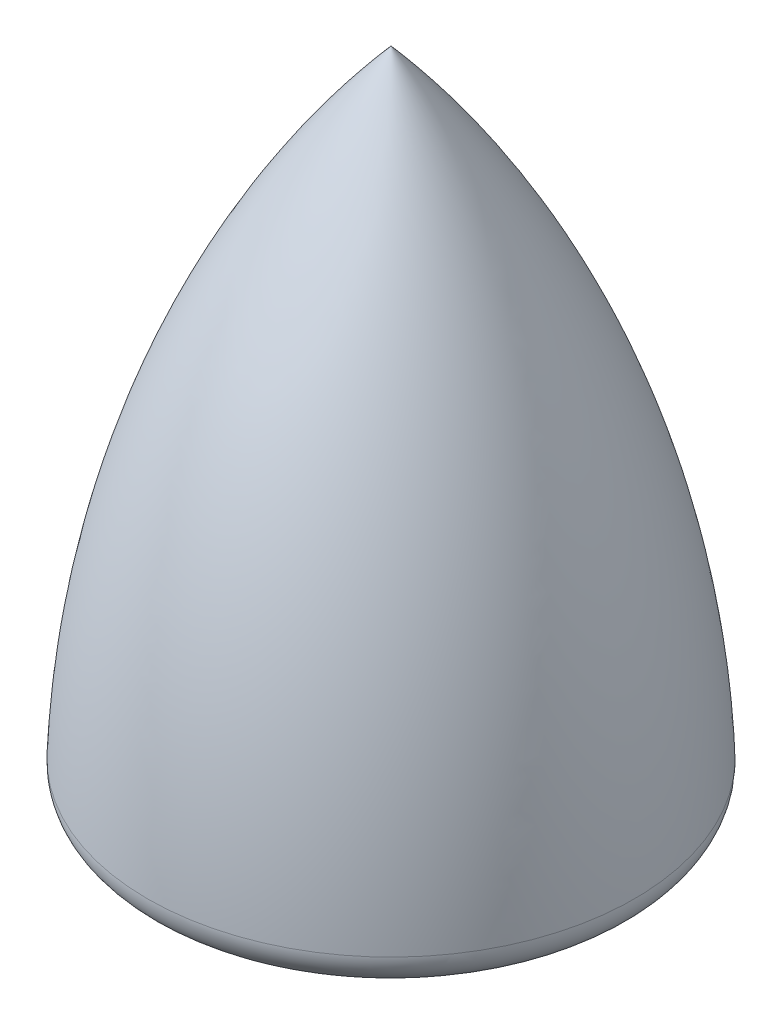
ISO-10303-21;
HEADER;
FILE_DESCRIPTION(('STEP AP214'),'2;1');
FILE_NAME('part.step','',(''),(''),'','','');
FILE_SCHEMA(('AUTOMOTIVE_DESIGN { 1 0 10303 214 1 1 1 1 }'));
ENDSEC;
DATA;
#1=APPLICATION_CONTEXT('core data for automotive mechanical design processes');
#2=APPLICATION_PROTOCOL_DEFINITION('international standard','automotive_design',2000,#1);
#3=PRODUCT_CONTEXT('',#1,'mechanical');
#4=PRODUCT('Part','Part','',(#3));
#5=PRODUCT_RELATED_PRODUCT_CATEGORY('part','',(#4));
#6=PRODUCT_DEFINITION_FORMATION('','',#4);
#7=PRODUCT_DEFINITION_CONTEXT('part definition',#1,'design');
#8=PRODUCT_DEFINITION('design','',#6,#7);
#9=PRODUCT_DEFINITION_SHAPE('','',#8);
#10=(LENGTH_UNIT() NAMED_UNIT(*) SI_UNIT(.MILLI.,.METRE.));
#11=(NAMED_UNIT(*) PLANE_ANGLE_UNIT() SI_UNIT($,.RADIAN.));
#12=(NAMED_UNIT(*) SI_UNIT($,.STERADIAN.) SOLID_ANGLE_UNIT());
#13=UNCERTAINTY_MEASURE_WITH_UNIT(LENGTH_MEASURE(1.E-05),#10,'distance_accuracy_value','');
#14=(GEOMETRIC_REPRESENTATION_CONTEXT(3) GLOBAL_UNCERTAINTY_ASSIGNED_CONTEXT((#13)) GLOBAL_UNIT_ASSIGNED_CONTEXT((#10,
#11,#12)) REPRESENTATION_CONTEXT('',''));
#15=CARTESIAN_POINT('',(0.,0.,0.));
#16=DIRECTION('',(0.,0.,1.));
#17=DIRECTION('',(1.,0.,0.));
#18=AXIS2_PLACEMENT_3D('',#15,#16,#17);
#19=CARTESIAN_POINT('',(0.,-10.571203495776,-23.2972106447363));
#20=DIRECTION('',(-1.,0.,0.));
#21=DIRECTION('',(0.,0.,1.));
#22=AXIS2_PLACEMENT_3D('',#19,#20,#21);
#23=CIRCLE('',#22,30.7975412642881);
#24=TRIMMED_CURVE('',#23,(PARAMETER_VALUE(-0.712907707576474)),
(PARAMETER_VALUE(0.712907707576474)),.T.,.PARAMETER.);
#25=CARTESIAN_POINT('',(0.,-10.571203495776,0.));
#26=DIRECTION('',(0.,1.,0.));
#27=AXIS1_PLACEMENT('',#25,#26);
#28=SURFACE_OF_REVOLUTION('',#24,#27);
#29=CARTESIAN_POINT('',(0.,-9.39015056837326,0.));
#30=DIRECTION('',(0.,-1.,0.));
#31=DIRECTION('',(0.,0.,-1.));
#32=AXIS2_PLACEMENT_3D('',#29,#30,#31);
#33=CIRCLE('',#32,7.47767622602573);
#34=CARTESIAN_POINT('',(0.,-9.39015056837326,-7.47767622602573));
#35=VERTEX_POINT('',#34);
#36=EDGE_CURVE('E40',#35,#35,#33,.F.);
#37=ORIENTED_EDGE('',*,*,#36,.T.);
#38=EDGE_LOOP('',(#37));
#39=FACE_BOUND('',#38,.T.);
#40=CARTESIAN_POINT('',(0.,9.57150049600011,0.));
#41=VERTEX_POINT('',#40);
#42=VERTEX_LOOP('',#41);
#43=FACE_BOUND('',#42,.T.);
#44=ADVANCED_FACE('F33',(#39,#43),#28,.T.);
#45=CARTESIAN_POINT('',(0.,-10.4284995039999,0.));
#46=DIRECTION('',(0.,1.,0.));
#47=DIRECTION('',(0.,0.,1.));
#48=AXIS2_PLACEMENT_3D('',#45,#46,#47);
#49=PLANE('',#48);
#50=CARTESIAN_POINT('',(0.,-10.4284995039999,0.));
#51=DIRECTION('',(0.,-1.,0.));
#52=DIRECTION('',(0.,0.,-1.));
#53=AXIS2_PLACEMENT_3D('',#50,#51,#52);
#54=CIRCLE('',#53,2.5);
#55=CARTESIAN_POINT('',(0.,-10.4284995039999,-2.5));
#56=VERTEX_POINT('',#55);
#57=EDGE_CURVE('E65',#56,#56,#54,.T.);
#58=ORIENTED_EDGE('',*,*,#57,.F.);
#59=EDGE_LOOP('',(#58));
#60=FACE_BOUND('',#59,.T.);
#61=CARTESIAN_POINT('',(0.,-10.4284995039999,0.));
#62=DIRECTION('',(0.,1.,0.));
#63=DIRECTION('',(0.,0.,1.));
#64=AXIS2_PLACEMENT_3D('',#61,#62,#63);
#65=CIRCLE('',#64,6.47841181700462);
#66=CARTESIAN_POINT('',(0.,-10.4284995039999,6.47841181700462));
#67=VERTEX_POINT('',#66);
#68=EDGE_CURVE('E11',#67,#67,#65,.F.);
#69=ORIENTED_EDGE('',*,*,#68,.T.);
#70=EDGE_LOOP('',(#69));
#71=FACE_BOUND('',#70,.T.);
#72=ADVANCED_FACE('F44',(#60,#71),#49,.F.);
#73=CARTESIAN_POINT('',(0.,-9.42849950399989,0.));
#74=DIRECTION('',(0.,1.,0.));
#75=DIRECTION('',(0.,0.,1.));
#76=AXIS2_PLACEMENT_3D('',#73,#74,#75);
#77=TOROIDAL_SURFACE('',#76,6.47841181700462,1.);
#78=ORIENTED_EDGE('',*,*,#68,.F.);
#79=EDGE_LOOP('',(#78));
#80=FACE_BOUND('',#79,.T.);
#81=ORIENTED_EDGE('',*,*,#36,.F.);
#82=EDGE_LOOP('',(#81));
#83=FACE_BOUND('',#82,.T.);
#84=ADVANCED_FACE('F35',(#80,#83),#77,.T.);
#85=CARTESIAN_POINT('',(0.,1.57150049600011,0.));
#86=DIRECTION('',(0.,-1.,0.));
#87=DIRECTION('',(0.,0.,-1.));
#88=AXIS2_PLACEMENT_3D('',#85,#86,#87);
#89=CYLINDRICAL_SURFACE('',#88,2.5);
#90=CARTESIAN_POINT('',(0.,1.57150049600011,0.));
#91=DIRECTION('',(0.,-1.,0.));
#92=DIRECTION('',(0.,0.,-1.));
#93=AXIS2_PLACEMENT_3D('',#90,#91,#92);
#94=CIRCLE('',#93,2.5);
#95=CARTESIAN_POINT('',(0.,1.57150049600011,-2.5));
#96=VERTEX_POINT('',#95);
#97=EDGE_CURVE('E64',#96,#96,#94,.T.);
#98=ORIENTED_EDGE('',*,*,#97,.F.);
#99=EDGE_LOOP('',(#98));
#100=FACE_BOUND('',#99,.T.);
#101=ORIENTED_EDGE('',*,*,#57,.T.);
#102=EDGE_LOOP('',(#101));
#103=FACE_BOUND('',#102,.T.);
#104=ADVANCED_FACE('F53',(#100,#103),#89,.F.);
#105=CARTESIAN_POINT('',(0.,1.57150049600011,0.));
#106=DIRECTION('',(0.,-1.,0.));
#107=DIRECTION('',(0.,0.,-1.));
#108=AXIS2_PLACEMENT_3D('',#105,#106,#107);
#109=PLANE('',#108);
#110=ORIENTED_EDGE('',*,*,#97,.T.);
#111=EDGE_LOOP('',(#110));
#112=FACE_BOUND('',#111,.T.);
#113=ADVANCED_FACE('F56',(#112),#109,.T.);
#114=CLOSED_SHELL('',(#44,#72,#84,#104,#113));
#115=MANIFOLD_SOLID_BREP('B2',#114);
#116=ADVANCED_BREP_SHAPE_REPRESENTATION('',(#18,#115),#14);
#117=SHAPE_DEFINITION_REPRESENTATION(#9,#116);
ENDSEC;
END-ISO-10303-21;
